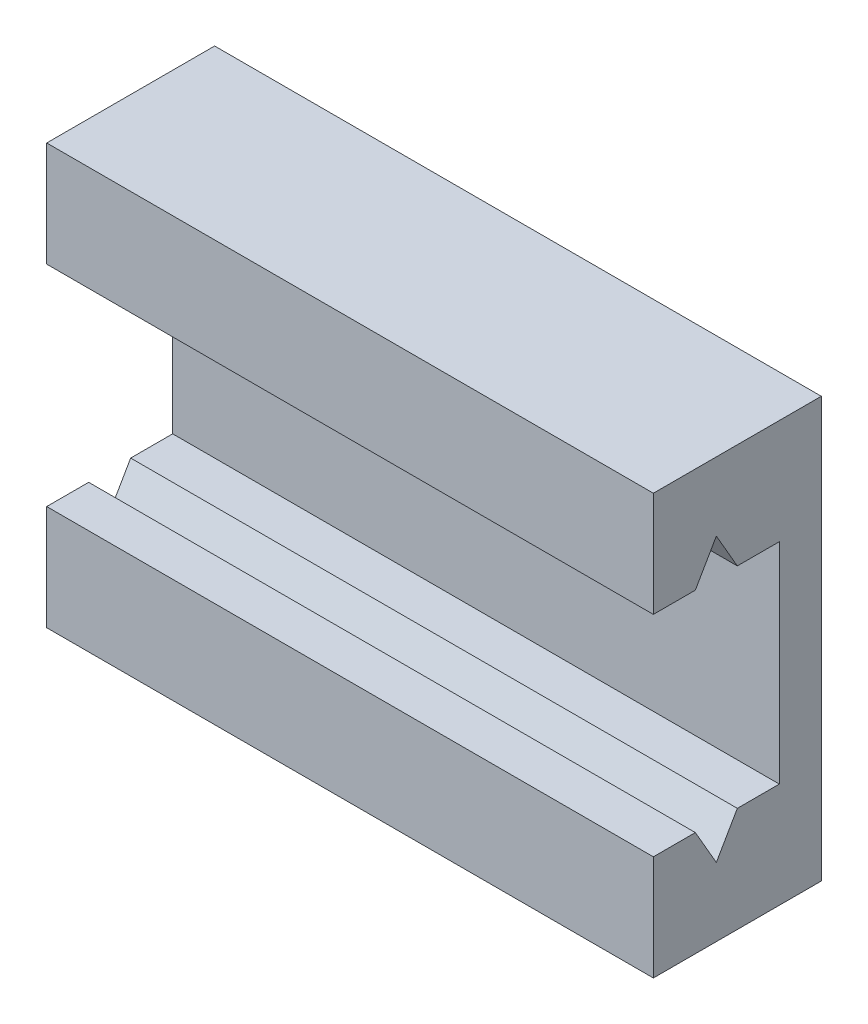
ISO-10303-21;
HEADER;
FILE_DESCRIPTION(('STEP AP214'),'2;1');
FILE_NAME('part.step','',(''),(''),'','','');
FILE_SCHEMA(('AUTOMOTIVE_DESIGN { 1 0 10303 214 1 1 1 1 }'));
ENDSEC;
DATA;
#1=APPLICATION_CONTEXT('core data for automotive mechanical design processes');
#2=APPLICATION_PROTOCOL_DEFINITION('international standard','automotive_design',2000,#1);
#3=PRODUCT_CONTEXT('',#1,'mechanical');
#4=PRODUCT('Part','Part','',(#3));
#5=PRODUCT_RELATED_PRODUCT_CATEGORY('part','',(#4));
#6=PRODUCT_DEFINITION_FORMATION('','',#4);
#7=PRODUCT_DEFINITION_CONTEXT('part definition',#1,'design');
#8=PRODUCT_DEFINITION('design','',#6,#7);
#9=PRODUCT_DEFINITION_SHAPE('','',#8);
#10=(LENGTH_UNIT() NAMED_UNIT(*) SI_UNIT(.MILLI.,.METRE.));
#11=(NAMED_UNIT(*) PLANE_ANGLE_UNIT() SI_UNIT($,.RADIAN.));
#12=(NAMED_UNIT(*) SI_UNIT($,.STERADIAN.) SOLID_ANGLE_UNIT());
#13=UNCERTAINTY_MEASURE_WITH_UNIT(LENGTH_MEASURE(1.E-05),#10,'distance_accuracy_value','');
#14=(GEOMETRIC_REPRESENTATION_CONTEXT(3) GLOBAL_UNCERTAINTY_ASSIGNED_CONTEXT((#13)) GLOBAL_UNIT_ASSIGNED_CONTEXT((#10,
#11,#12)) REPRESENTATION_CONTEXT('',''));
#15=CARTESIAN_POINT('',(0.,0.,0.));
#16=DIRECTION('',(0.,0.,1.));
#17=DIRECTION('',(1.,0.,0.));
#18=AXIS2_PLACEMENT_3D('',#15,#16,#17);
#19=CARTESIAN_POINT('',(0.,0.,8.));
#20=DIRECTION('',(0.,0.,-1.));
#21=DIRECTION('',(-1.,0.,0.));
#22=AXIS2_PLACEMENT_3D('',#19,#20,#21);
#23=PLANE('',#22);
#24=DIRECTION('',(0.,-1.,0.));
#25=VECTOR('',#24,1.);
#26=CARTESIAN_POINT('',(0.,0.,8.));
#27=LINE('',#26,#25);
#28=CARTESIAN_POINT('',(0.,20.,8.));
#29=VERTEX_POINT('',#28);
#30=CARTESIAN_POINT('',(0.,15.,8.));
#31=VERTEX_POINT('',#30);
#32=EDGE_CURVE('E195',#29,#31,#27,.T.);
#33=ORIENTED_EDGE('',*,*,#32,.T.);
#34=DIRECTION('',(1.,0.,0.));
#35=VECTOR('',#34,1.);
#36=CARTESIAN_POINT('',(-0.001000000000001,15.,8.));
#37=LINE('',#36,#35);
#38=CARTESIAN_POINT('',(28.9,15.,8.));
#39=VERTEX_POINT('',#38);
#40=EDGE_CURVE('E200',#31,#39,#37,.T.);
#41=ORIENTED_EDGE('',*,*,#40,.T.);
#42=DIRECTION('',(0.,1.,0.));
#43=VECTOR('',#42,1.);
#44=CARTESIAN_POINT('',(28.9,0.,8.));
#45=LINE('',#44,#43);
#46=CARTESIAN_POINT('',(28.9,20.,8.));
#47=VERTEX_POINT('',#46);
#48=EDGE_CURVE('E167',#39,#47,#45,.T.);
#49=ORIENTED_EDGE('',*,*,#48,.T.);
#50=DIRECTION('',(-1.,0.,0.));
#51=VECTOR('',#50,1.);
#52=CARTESIAN_POINT('',(0.,20.,8.));
#53=LINE('',#52,#51);
#54=EDGE_CURVE('E59',#47,#29,#53,.T.);
#55=ORIENTED_EDGE('',*,*,#54,.T.);
#56=EDGE_LOOP('',(#33,#41,#49,#55));
#57=FACE_BOUND('',#56,.T.);
#58=ADVANCED_FACE('F35',(#57),#23,.F.);
#59=CARTESIAN_POINT('',(0.,0.,8.));
#60=DIRECTION('',(1.,0.,0.));
#61=DIRECTION('',(0.,0.,-1.));
#62=AXIS2_PLACEMENT_3D('',#59,#60,#61);
#63=PLANE('',#62);
#64=DIRECTION('',(0.,0.86602540378444,-0.499999999999998));
#65=VECTOR('',#64,1.);
#66=CARTESIAN_POINT('',(0.,15.,6.));
#67=LINE('',#66,#65);
#68=CARTESIAN_POINT('',(0.,15.,6.));
#69=VERTEX_POINT('',#68);
#70=CARTESIAN_POINT('',(0.,16.7320508075689,5.));
#71=VERTEX_POINT('',#70);
#72=EDGE_CURVE('E250',#69,#71,#67,.T.);
#73=ORIENTED_EDGE('',*,*,#72,.F.);
#74=DIRECTION('',(0.,0.,-1.));
#75=VECTOR('',#74,1.);
#76=CARTESIAN_POINT('',(0.,15.,8.));
#77=LINE('',#76,#75);
#78=EDGE_CURVE('E162',#31,#69,#77,.T.);
#79=ORIENTED_EDGE('',*,*,#78,.F.);
#80=ORIENTED_EDGE('',*,*,#32,.F.);
#81=DIRECTION('',(0.,0.,-1.));
#82=VECTOR('',#81,1.);
#83=CARTESIAN_POINT('',(0.,20.,8.));
#84=LINE('',#83,#82);
#85=CARTESIAN_POINT('',(0.,20.,0.));
#86=VERTEX_POINT('',#85);
#87=EDGE_CURVE('E169',#29,#86,#84,.T.);
#88=ORIENTED_EDGE('',*,*,#87,.T.);
#89=DIRECTION('',(0.,-1.,0.));
#90=VECTOR('',#89,1.);
#91=CARTESIAN_POINT('',(0.,0.,0.));
#92=LINE('',#91,#90);
#93=CARTESIAN_POINT('',(0.,0.,0.));
#94=VERTEX_POINT('',#93);
#95=EDGE_CURVE('E174',#86,#94,#92,.T.);
#96=ORIENTED_EDGE('',*,*,#95,.T.);
#97=DIRECTION('',(0.,0.,-1.));
#98=VECTOR('',#97,1.);
#99=CARTESIAN_POINT('',(0.,0.,8.));
#100=LINE('',#99,#98);
#101=CARTESIAN_POINT('',(0.,0.,8.));
#102=VERTEX_POINT('',#101);
#103=EDGE_CURVE('E11',#102,#94,#100,.T.);
#104=ORIENTED_EDGE('',*,*,#103,.F.);
#105=CARTESIAN_POINT('',(0.,5.,8.));
#106=VERTEX_POINT('',#105);
#107=EDGE_CURVE('E87',#106,#102,#27,.T.);
#108=ORIENTED_EDGE('',*,*,#107,.F.);
#109=DIRECTION('',(0.,0.,1.));
#110=VECTOR('',#109,1.);
#111=CARTESIAN_POINT('',(0.,5.,8.));
#112=LINE('',#111,#110);
#113=CARTESIAN_POINT('',(0.,5.,6.));
#114=VERTEX_POINT('',#113);
#115=EDGE_CURVE('E50',#114,#106,#112,.T.);
#116=ORIENTED_EDGE('',*,*,#115,.F.);
#117=DIRECTION('',(0.,0.86602540378444,0.499999999999998));
#118=VECTOR('',#117,1.);
#119=CARTESIAN_POINT('',(0.,5.,6.));
#120=LINE('',#119,#118);
#121=CARTESIAN_POINT('',(0.,3.26794919243112,5.));
#122=VERTEX_POINT('',#121);
#123=EDGE_CURVE('E226',#122,#114,#120,.T.);
#124=ORIENTED_EDGE('',*,*,#123,.F.);
#125=DIRECTION('',(0.,-0.86602540378444,0.499999999999998));
#126=VECTOR('',#125,1.);
#127=CARTESIAN_POINT('',(0.,3.26794919243112,5.));
#128=LINE('',#127,#126);
#129=CARTESIAN_POINT('',(0.,5.,4.));
#130=VERTEX_POINT('',#129);
#131=EDGE_CURVE('E229',#130,#122,#128,.T.);
#132=ORIENTED_EDGE('',*,*,#131,.F.);
#133=DIRECTION('',(0.,0.,1.));
#134=VECTOR('',#133,1.);
#135=CARTESIAN_POINT('',(0.,5.,4.));
#136=LINE('',#135,#134);
#137=CARTESIAN_POINT('',(0.,5.,2.));
#138=VERTEX_POINT('',#137);
#139=EDGE_CURVE('E232',#138,#130,#136,.T.);
#140=ORIENTED_EDGE('',*,*,#139,.F.);
#141=DIRECTION('',(0.,-1.,0.));
#142=VECTOR('',#141,1.);
#143=CARTESIAN_POINT('',(0.,15.,2.));
#144=LINE('',#143,#142);
#145=CARTESIAN_POINT('',(0.,15.,2.));
#146=VERTEX_POINT('',#145);
#147=EDGE_CURVE('E241',#146,#138,#144,.T.);
#148=ORIENTED_EDGE('',*,*,#147,.F.);
#149=DIRECTION('',(0.,0.,-1.));
#150=VECTOR('',#149,1.);
#151=CARTESIAN_POINT('',(0.,15.,4.));
#152=LINE('',#151,#150);
#153=CARTESIAN_POINT('',(0.,15.,4.));
#154=VERTEX_POINT('',#153);
#155=EDGE_CURVE('E244',#154,#146,#152,.T.);
#156=ORIENTED_EDGE('',*,*,#155,.F.);
#157=DIRECTION('',(0.,-0.86602540378444,-0.499999999999998));
#158=VECTOR('',#157,1.);
#159=CARTESIAN_POINT('',(0.,16.7320508075689,5.));
#160=LINE('',#159,#158);
#161=EDGE_CURVE('E247',#71,#154,#160,.T.);
#162=ORIENTED_EDGE('',*,*,#161,.F.);
#163=EDGE_LOOP('',(#73,#79,#80,#88,#96,#104,#108,#116,#124,#132,#140,#148,#156,#162));
#164=FACE_BOUND('',#163,.T.);
#165=ADVANCED_FACE('F37',(#164),#63,.F.);
#166=CARTESIAN_POINT('',(0.,0.,8.));
#167=DIRECTION('',(0.,1.,0.));
#168=DIRECTION('',(0.,0.,1.));
#169=AXIS2_PLACEMENT_3D('',#166,#167,#168);
#170=PLANE('',#169);
#171=DIRECTION('',(1.,0.,0.));
#172=VECTOR('',#171,1.);
#173=CARTESIAN_POINT('',(0.,0.,0.));
#174=LINE('',#173,#172);
#175=CARTESIAN_POINT('',(28.9,0.,0.));
#176=VERTEX_POINT('',#175);
#177=EDGE_CURVE('E177',#94,#176,#174,.T.);
#178=ORIENTED_EDGE('',*,*,#177,.T.);
#179=DIRECTION('',(0.,0.,-1.));
#180=VECTOR('',#179,1.);
#181=CARTESIAN_POINT('',(28.9,0.,8.));
#182=LINE('',#181,#180);
#183=CARTESIAN_POINT('',(28.9,0.,8.));
#184=VERTEX_POINT('',#183);
#185=EDGE_CURVE('E43',#184,#176,#182,.T.);
#186=ORIENTED_EDGE('',*,*,#185,.F.);
#187=DIRECTION('',(1.,0.,0.));
#188=VECTOR('',#187,1.);
#189=CARTESIAN_POINT('',(0.,0.,8.));
#190=LINE('',#189,#188);
#191=EDGE_CURVE('E165',#102,#184,#190,.T.);
#192=ORIENTED_EDGE('',*,*,#191,.F.);
#193=ORIENTED_EDGE('',*,*,#103,.T.);
#194=EDGE_LOOP('',(#178,#186,#192,#193));
#195=FACE_BOUND('',#194,.T.);
#196=ADVANCED_FACE('F305',(#195),#170,.F.);
#197=CARTESIAN_POINT('',(28.9,0.,8.));
#198=DIRECTION('',(-1.,0.,0.));
#199=DIRECTION('',(0.,0.,1.));
#200=AXIS2_PLACEMENT_3D('',#197,#198,#199);
#201=PLANE('',#200);
#202=ORIENTED_EDGE('',*,*,#48,.F.);
#203=DIRECTION('',(0.,0.,1.));
#204=VECTOR('',#203,1.);
#205=CARTESIAN_POINT('',(28.9,15.,8.));
#206=LINE('',#205,#204);
#207=CARTESIAN_POINT('',(28.9,15.,6.));
#208=VERTEX_POINT('',#207);
#209=EDGE_CURVE('E151',#208,#39,#206,.T.);
#210=ORIENTED_EDGE('',*,*,#209,.F.);
#211=DIRECTION('',(0.,-0.86602540378444,0.499999999999998));
#212=VECTOR('',#211,1.);
#213=CARTESIAN_POINT('',(28.9,15.,6.));
#214=LINE('',#213,#212);
#215=CARTESIAN_POINT('',(28.9,16.7320508075689,5.));
#216=VERTEX_POINT('',#215);
#217=EDGE_CURVE('E269',#216,#208,#214,.T.);
#218=ORIENTED_EDGE('',*,*,#217,.F.);
#219=DIRECTION('',(0.,0.86602540378444,0.499999999999998));
#220=VECTOR('',#219,1.);
#221=CARTESIAN_POINT('',(28.9,16.7320508075689,5.));
#222=LINE('',#221,#220);
#223=CARTESIAN_POINT('',(28.9,15.,4.));
#224=VERTEX_POINT('',#223);
#225=EDGE_CURVE('E267',#224,#216,#222,.T.);
#226=ORIENTED_EDGE('',*,*,#225,.F.);
#227=DIRECTION('',(0.,0.,1.));
#228=VECTOR('',#227,1.);
#229=CARTESIAN_POINT('',(28.9,15.,4.));
#230=LINE('',#229,#228);
#231=CARTESIAN_POINT('',(28.9,15.,2.));
#232=VERTEX_POINT('',#231);
#233=EDGE_CURVE('E264',#232,#224,#230,.T.);
#234=ORIENTED_EDGE('',*,*,#233,.F.);
#235=DIRECTION('',(0.,1.,0.));
#236=VECTOR('',#235,1.);
#237=CARTESIAN_POINT('',(28.9,15.,2.));
#238=LINE('',#237,#236);
#239=CARTESIAN_POINT('',(28.9,5.,2.));
#240=VERTEX_POINT('',#239);
#241=EDGE_CURVE('E261',#240,#232,#238,.T.);
#242=ORIENTED_EDGE('',*,*,#241,.F.);
#243=DIRECTION('',(0.,0.,-1.));
#244=VECTOR('',#243,1.);
#245=CARTESIAN_POINT('',(28.9,5.,4.));
#246=LINE('',#245,#244);
#247=CARTESIAN_POINT('',(28.9,5.,4.));
#248=VERTEX_POINT('',#247);
#249=EDGE_CURVE('E258',#248,#240,#246,.T.);
#250=ORIENTED_EDGE('',*,*,#249,.F.);
#251=DIRECTION('',(0.,0.86602540378444,-0.499999999999998));
#252=VECTOR('',#251,1.);
#253=CARTESIAN_POINT('',(28.9,3.26794919243112,5.));
#254=LINE('',#253,#252);
#255=CARTESIAN_POINT('',(28.9,3.26794919243112,5.));
#256=VERTEX_POINT('',#255);
#257=EDGE_CURVE('E255',#256,#248,#254,.T.);
#258=ORIENTED_EDGE('',*,*,#257,.F.);
#259=DIRECTION('',(0.,-0.86602540378444,-0.499999999999998));
#260=VECTOR('',#259,1.);
#261=CARTESIAN_POINT('',(28.9,5.,6.));
#262=LINE('',#261,#260);
#263=CARTESIAN_POINT('',(28.9,5.,6.));
#264=VERTEX_POINT('',#263);
#265=EDGE_CURVE('E161',#264,#256,#262,.T.);
#266=ORIENTED_EDGE('',*,*,#265,.F.);
#267=DIRECTION('',(0.,0.,-1.));
#268=VECTOR('',#267,1.);
#269=CARTESIAN_POINT('',(28.9,5.,8.));
#270=LINE('',#269,#268);
#271=CARTESIAN_POINT('',(28.9,5.,8.));
#272=VERTEX_POINT('',#271);
#273=EDGE_CURVE('E147',#272,#264,#270,.T.);
#274=ORIENTED_EDGE('',*,*,#273,.F.);
#275=EDGE_CURVE('E158',#184,#272,#45,.T.);
#276=ORIENTED_EDGE('',*,*,#275,.F.);
#277=ORIENTED_EDGE('',*,*,#185,.T.);
#278=DIRECTION('',(0.,1.,0.));
#279=VECTOR('',#278,1.);
#280=CARTESIAN_POINT('',(28.9,0.,0.));
#281=LINE('',#280,#279);
#282=CARTESIAN_POINT('',(28.9,20.,0.));
#283=VERTEX_POINT('',#282);
#284=EDGE_CURVE('E179',#176,#283,#281,.T.);
#285=ORIENTED_EDGE('',*,*,#284,.T.);
#286=DIRECTION('',(0.,0.,-1.));
#287=VECTOR('',#286,1.);
#288=CARTESIAN_POINT('',(28.9,20.,8.));
#289=LINE('',#288,#287);
#290=EDGE_CURVE('E183',#47,#283,#289,.T.);
#291=ORIENTED_EDGE('',*,*,#290,.F.);
#292=EDGE_LOOP('',(#202,#210,#218,#226,#234,#242,#250,#258,#266,#274,#276,#277,#285,#291));
#293=FACE_BOUND('',#292,.T.);
#294=ADVANCED_FACE('F156',(#293),#201,.F.);
#295=CARTESIAN_POINT('',(0.,20.,8.));
#296=DIRECTION('',(0.,-1.,0.));
#297=DIRECTION('',(0.,0.,-1.));
#298=AXIS2_PLACEMENT_3D('',#295,#296,#297);
#299=PLANE('',#298);
#300=DIRECTION('',(-1.,0.,0.));
#301=VECTOR('',#300,1.);
#302=CARTESIAN_POINT('',(0.,20.,0.));
#303=LINE('',#302,#301);
#304=EDGE_CURVE('E80',#283,#86,#303,.T.);
#305=ORIENTED_EDGE('',*,*,#304,.T.);
#306=ORIENTED_EDGE('',*,*,#87,.F.);
#307=ORIENTED_EDGE('',*,*,#54,.F.);
#308=ORIENTED_EDGE('',*,*,#290,.T.);
#309=EDGE_LOOP('',(#305,#306,#307,#308));
#310=FACE_BOUND('',#309,.T.);
#311=ADVANCED_FACE('F196',(#310),#299,.F.);
#312=ORIENTED_EDGE('',*,*,#275,.T.);
#313=DIRECTION('',(1.,0.,0.));
#314=VECTOR('',#313,1.);
#315=CARTESIAN_POINT('',(-0.001000000000001,5.,8.));
#316=LINE('',#315,#314);
#317=EDGE_CURVE('E144',#106,#272,#316,.T.);
#318=ORIENTED_EDGE('',*,*,#317,.F.);
#319=ORIENTED_EDGE('',*,*,#107,.T.);
#320=ORIENTED_EDGE('',*,*,#191,.T.);
#321=EDGE_LOOP('',(#312,#318,#319,#320));
#322=FACE_BOUND('',#321,.T.);
#323=ADVANCED_FACE('F164',(#322),#23,.F.);
#324=CARTESIAN_POINT('',(0.,0.,0.));
#325=DIRECTION('',(0.,0.,-1.));
#326=DIRECTION('',(-1.,0.,0.));
#327=AXIS2_PLACEMENT_3D('',#324,#325,#326);
#328=PLANE('',#327);
#329=CARTESIAN_POINT('',(9.45,17.5,0.));
#330=DIRECTION('',(0.,0.,-1.));
#331=DIRECTION('',(-1.,0.,0.));
#332=AXIS2_PLACEMENT_3D('',#329,#330,#331);
#333=CIRCLE('',#332,1.5);
#334=CARTESIAN_POINT('',(7.94999999999999,17.5,0.));
#335=VERTEX_POINT('',#334);
#336=EDGE_CURVE('E492',#335,#335,#333,.T.);
#337=ORIENTED_EDGE('',*,*,#336,.F.);
#338=EDGE_LOOP('',(#337));
#339=FACE_BOUND('',#338,.T.);
#340=CARTESIAN_POINT('',(19.45,2.5,0.));
#341=DIRECTION('',(0.,0.,-1.));
#342=DIRECTION('',(-1.,0.,0.));
#343=AXIS2_PLACEMENT_3D('',#340,#341,#342);
#344=CIRCLE('',#343,1.5);
#345=CARTESIAN_POINT('',(17.95,2.5,0.));
#346=VERTEX_POINT('',#345);
#347=EDGE_CURVE('E504',#346,#346,#344,.T.);
#348=ORIENTED_EDGE('',*,*,#347,.F.);
#349=EDGE_LOOP('',(#348));
#350=FACE_BOUND('',#349,.T.);
#351=CARTESIAN_POINT('',(9.45,2.5,0.));
#352=DIRECTION('',(0.,0.,-1.));
#353=DIRECTION('',(-1.,0.,0.));
#354=AXIS2_PLACEMENT_3D('',#351,#352,#353);
#355=CIRCLE('',#354,1.5);
#356=CARTESIAN_POINT('',(7.94999999999999,2.5,0.));
#357=VERTEX_POINT('',#356);
#358=EDGE_CURVE('E499',#357,#357,#355,.T.);
#359=ORIENTED_EDGE('',*,*,#358,.F.);
#360=EDGE_LOOP('',(#359));
#361=FACE_BOUND('',#360,.T.);
#362=CARTESIAN_POINT('',(19.45,17.5,0.));
#363=DIRECTION('',(0.,0.,-1.));
#364=DIRECTION('',(-1.,0.,0.));
#365=AXIS2_PLACEMENT_3D('',#362,#363,#364);
#366=CIRCLE('',#365,1.5);
#367=CARTESIAN_POINT('',(17.95,17.5,0.));
#368=VERTEX_POINT('',#367);
#369=EDGE_CURVE('E235',#368,#368,#366,.T.);
#370=ORIENTED_EDGE('',*,*,#369,.F.);
#371=EDGE_LOOP('',(#370));
#372=FACE_BOUND('',#371,.T.);
#373=ORIENTED_EDGE('',*,*,#95,.F.);
#374=ORIENTED_EDGE('',*,*,#304,.F.);
#375=ORIENTED_EDGE('',*,*,#284,.F.);
#376=ORIENTED_EDGE('',*,*,#177,.F.);
#377=EDGE_LOOP('',(#373,#374,#375,#376));
#378=FACE_BOUND('',#377,.T.);
#379=ADVANCED_FACE('F189',(#339,#350,#361,#372,#378),#328,.T.);
#380=CARTESIAN_POINT('',(-0.001000000000001,15.,8.));
#381=DIRECTION('',(0.,1.,0.));
#382=DIRECTION('',(0.,0.,1.));
#383=AXIS2_PLACEMENT_3D('',#380,#381,#382);
#384=PLANE('',#383);
#385=ORIENTED_EDGE('',*,*,#78,.T.);
#386=DIRECTION('',(1.,0.,0.));
#387=VECTOR('',#386,1.);
#388=CARTESIAN_POINT('',(-0.001000000000001,15.,6.));
#389=LINE('',#388,#387);
#390=EDGE_CURVE('E203',#69,#208,#389,.T.);
#391=ORIENTED_EDGE('',*,*,#390,.T.);
#392=ORIENTED_EDGE('',*,*,#209,.T.);
#393=ORIENTED_EDGE('',*,*,#40,.F.);
#394=EDGE_LOOP('',(#385,#391,#392,#393));
#395=FACE_BOUND('',#394,.T.);
#396=ADVANCED_FACE('F272',(#395),#384,.F.);
#397=CARTESIAN_POINT('',(-0.001000000000001,15.,6.));
#398=DIRECTION('',(0.,0.499999999999998,0.86602540378444));
#399=DIRECTION('',(0.,-0.86602540378444,0.499999999999998));
#400=AXIS2_PLACEMENT_3D('',#397,#398,#399);
#401=PLANE('',#400);
#402=ORIENTED_EDGE('',*,*,#72,.T.);
#403=DIRECTION('',(1.,0.,0.));
#404=VECTOR('',#403,1.);
#405=CARTESIAN_POINT('',(-0.001000000000001,16.7320508075689,5.));
#406=LINE('',#405,#404);
#407=EDGE_CURVE('E206',#71,#216,#406,.T.);
#408=ORIENTED_EDGE('',*,*,#407,.T.);
#409=ORIENTED_EDGE('',*,*,#217,.T.);
#410=ORIENTED_EDGE('',*,*,#390,.F.);
#411=EDGE_LOOP('',(#402,#408,#409,#410));
#412=FACE_BOUND('',#411,.T.);
#413=ADVANCED_FACE('F273',(#412),#401,.F.);
#414=CARTESIAN_POINT('',(-0.001000000000001,16.7320508075689,5.));
#415=DIRECTION('',(0.,0.499999999999998,-0.86602540378444));
#416=DIRECTION('',(0.,0.86602540378444,0.499999999999998));
#417=AXIS2_PLACEMENT_3D('',#414,#415,#416);
#418=PLANE('',#417);
#419=ORIENTED_EDGE('',*,*,#161,.T.);
#420=DIRECTION('',(1.,0.,0.));
#421=VECTOR('',#420,1.);
#422=CARTESIAN_POINT('',(-0.001000000000001,15.,4.));
#423=LINE('',#422,#421);
#424=EDGE_CURVE('E212',#154,#224,#423,.T.);
#425=ORIENTED_EDGE('',*,*,#424,.T.);
#426=ORIENTED_EDGE('',*,*,#225,.T.);
#427=ORIENTED_EDGE('',*,*,#407,.F.);
#428=EDGE_LOOP('',(#419,#425,#426,#427));
#429=FACE_BOUND('',#428,.T.);
#430=ADVANCED_FACE('F278',(#429),#418,.F.);
#431=CARTESIAN_POINT('',(-0.001000000000001,15.,4.));
#432=DIRECTION('',(0.,1.,0.));
#433=DIRECTION('',(0.,0.,1.));
#434=AXIS2_PLACEMENT_3D('',#431,#432,#433);
#435=PLANE('',#434);
#436=ORIENTED_EDGE('',*,*,#155,.T.);
#437=DIRECTION('',(1.,0.,0.));
#438=VECTOR('',#437,1.);
#439=CARTESIAN_POINT('',(-0.001000000000001,15.,2.));
#440=LINE('',#439,#438);
#441=EDGE_CURVE('E214',#146,#232,#440,.T.);
#442=ORIENTED_EDGE('',*,*,#441,.T.);
#443=ORIENTED_EDGE('',*,*,#233,.T.);
#444=ORIENTED_EDGE('',*,*,#424,.F.);
#445=EDGE_LOOP('',(#436,#442,#443,#444));
#446=FACE_BOUND('',#445,.T.);
#447=ADVANCED_FACE('F284',(#446),#435,.F.);
#448=CARTESIAN_POINT('',(-0.001000000000001,15.,2.));
#449=DIRECTION('',(0.,0.,-1.));
#450=DIRECTION('',(-1.,0.,0.));
#451=AXIS2_PLACEMENT_3D('',#448,#449,#450);
#452=PLANE('',#451);
#453=ORIENTED_EDGE('',*,*,#147,.T.);
#454=DIRECTION('',(1.,0.,0.));
#455=VECTOR('',#454,1.);
#456=CARTESIAN_POINT('',(-0.001000000000001,5.,2.));
#457=LINE('',#456,#455);
#458=EDGE_CURVE('E216',#138,#240,#457,.T.);
#459=ORIENTED_EDGE('',*,*,#458,.T.);
#460=ORIENTED_EDGE('',*,*,#241,.T.);
#461=ORIENTED_EDGE('',*,*,#441,.F.);
#462=EDGE_LOOP('',(#453,#459,#460,#461));
#463=FACE_BOUND('',#462,.T.);
#464=ADVANCED_FACE('F286',(#463),#452,.F.);
#465=CARTESIAN_POINT('',(-0.001000000000001,5.,4.));
#466=DIRECTION('',(0.,-1.,0.));
#467=DIRECTION('',(0.,0.,-1.));
#468=AXIS2_PLACEMENT_3D('',#465,#466,#467);
#469=PLANE('',#468);
#470=ORIENTED_EDGE('',*,*,#139,.T.);
#471=DIRECTION('',(1.,0.,0.));
#472=VECTOR('',#471,1.);
#473=CARTESIAN_POINT('',(-0.001000000000001,5.,4.));
#474=LINE('',#473,#472);
#475=EDGE_CURVE('E218',#130,#248,#474,.T.);
#476=ORIENTED_EDGE('',*,*,#475,.T.);
#477=ORIENTED_EDGE('',*,*,#249,.T.);
#478=ORIENTED_EDGE('',*,*,#458,.F.);
#479=EDGE_LOOP('',(#470,#476,#477,#478));
#480=FACE_BOUND('',#479,.T.);
#481=ADVANCED_FACE('F289',(#480),#469,.F.);
#482=CARTESIAN_POINT('',(-0.001000000000001,3.26794919243112,5.));
#483=DIRECTION('',(0.,-0.499999999999998,-0.86602540378444));
#484=DIRECTION('',(0.,0.86602540378444,-0.499999999999998));
#485=AXIS2_PLACEMENT_3D('',#482,#483,#484);
#486=PLANE('',#485);
#487=ORIENTED_EDGE('',*,*,#131,.T.);
#488=DIRECTION('',(1.,0.,0.));
#489=VECTOR('',#488,1.);
#490=CARTESIAN_POINT('',(-0.001000000000001,3.26794919243112,5.));
#491=LINE('',#490,#489);
#492=EDGE_CURVE('E220',#122,#256,#491,.T.);
#493=ORIENTED_EDGE('',*,*,#492,.T.);
#494=ORIENTED_EDGE('',*,*,#257,.T.);
#495=ORIENTED_EDGE('',*,*,#475,.F.);
#496=EDGE_LOOP('',(#487,#493,#494,#495));
#497=FACE_BOUND('',#496,.T.);
#498=ADVANCED_FACE('F291',(#497),#486,.F.);
#499=CARTESIAN_POINT('',(-0.001000000000001,5.,6.));
#500=DIRECTION('',(0.,-0.499999999999998,0.86602540378444));
#501=DIRECTION('',(0.,-0.86602540378444,-0.499999999999998));
#502=AXIS2_PLACEMENT_3D('',#499,#500,#501);
#503=PLANE('',#502);
#504=ORIENTED_EDGE('',*,*,#123,.T.);
#505=DIRECTION('',(1.,0.,0.));
#506=VECTOR('',#505,1.);
#507=CARTESIAN_POINT('',(-0.001000000000001,5.,6.));
#508=LINE('',#507,#506);
#509=EDGE_CURVE('E150',#114,#264,#508,.T.);
#510=ORIENTED_EDGE('',*,*,#509,.T.);
#511=ORIENTED_EDGE('',*,*,#265,.T.);
#512=ORIENTED_EDGE('',*,*,#492,.F.);
#513=EDGE_LOOP('',(#504,#510,#511,#512));
#514=FACE_BOUND('',#513,.T.);
#515=ADVANCED_FACE('F224',(#514),#503,.F.);
#516=CARTESIAN_POINT('',(-0.001000000000001,5.,8.));
#517=DIRECTION('',(0.,-1.,0.));
#518=DIRECTION('',(0.,0.,-1.));
#519=AXIS2_PLACEMENT_3D('',#516,#517,#518);
#520=PLANE('',#519);
#521=ORIENTED_EDGE('',*,*,#115,.T.);
#522=ORIENTED_EDGE('',*,*,#317,.T.);
#523=ORIENTED_EDGE('',*,*,#273,.T.);
#524=ORIENTED_EDGE('',*,*,#509,.F.);
#525=EDGE_LOOP('',(#521,#522,#523,#524));
#526=FACE_BOUND('',#525,.T.);
#527=ADVANCED_FACE('F146',(#526),#520,.F.);
#528=CARTESIAN_POINT('',(19.45,17.5,4.));
#529=DIRECTION('',(0.,0.,-1.));
#530=DIRECTION('',(-1.,0.,0.));
#531=AXIS2_PLACEMENT_3D('',#528,#529,#530);
#532=CYLINDRICAL_SURFACE('',#531,1.5);
#533=CARTESIAN_POINT('',(19.45,17.5,4.));
#534=DIRECTION('',(0.,0.,-1.));
#535=DIRECTION('',(-1.,0.,0.));
#536=AXIS2_PLACEMENT_3D('',#533,#534,#535);
#537=CIRCLE('',#536,1.5);
#538=CARTESIAN_POINT('',(17.95,17.5,4.));
#539=VERTEX_POINT('',#538);
#540=EDGE_CURVE('E230',#539,#539,#537,.T.);
#541=ORIENTED_EDGE('',*,*,#540,.F.);
#542=EDGE_LOOP('',(#541));
#543=FACE_BOUND('',#542,.T.);
#544=ORIENTED_EDGE('',*,*,#369,.T.);
#545=EDGE_LOOP('',(#544));
#546=FACE_BOUND('',#545,.T.);
#547=ADVANCED_FACE('F402',(#543,#546),#532,.F.);
#548=CARTESIAN_POINT('',(19.45,17.5,4.));
#549=DIRECTION('',(0.,0.,-1.));
#550=DIRECTION('',(-1.,0.,0.));
#551=AXIS2_PLACEMENT_3D('',#548,#549,#550);
#552=PLANE('',#551);
#553=ORIENTED_EDGE('',*,*,#540,.T.);
#554=EDGE_LOOP('',(#553));
#555=FACE_BOUND('',#554,.T.);
#556=ADVANCED_FACE('F415',(#555),#552,.T.);
#557=CARTESIAN_POINT('',(9.45,2.5,4.));
#558=DIRECTION('',(0.,0.,-1.));
#559=DIRECTION('',(-1.,0.,0.));
#560=AXIS2_PLACEMENT_3D('',#557,#558,#559);
#561=CYLINDRICAL_SURFACE('',#560,1.5);
#562=CARTESIAN_POINT('',(9.45,2.5,4.));
#563=DIRECTION('',(0.,0.,-1.));
#564=DIRECTION('',(-1.,0.,0.));
#565=AXIS2_PLACEMENT_3D('',#562,#563,#564);
#566=CIRCLE('',#565,1.5);
#567=CARTESIAN_POINT('',(7.94999999999999,2.5,4.));
#568=VERTEX_POINT('',#567);
#569=EDGE_CURVE('E506',#568,#568,#566,.T.);
#570=ORIENTED_EDGE('',*,*,#569,.F.);
#571=EDGE_LOOP('',(#570));
#572=FACE_BOUND('',#571,.T.);
#573=ORIENTED_EDGE('',*,*,#358,.T.);
#574=EDGE_LOOP('',(#573));
#575=FACE_BOUND('',#574,.T.);
#576=ADVANCED_FACE('F425',(#572,#575),#561,.F.);
#577=CARTESIAN_POINT('',(9.45,2.5,4.));
#578=DIRECTION('',(0.,0.,-1.));
#579=DIRECTION('',(-1.,0.,0.));
#580=AXIS2_PLACEMENT_3D('',#577,#578,#579);
#581=PLANE('',#580);
#582=ORIENTED_EDGE('',*,*,#569,.T.);
#583=EDGE_LOOP('',(#582));
#584=FACE_BOUND('',#583,.T.);
#585=ADVANCED_FACE('F435',(#584),#581,.T.);
#586=CARTESIAN_POINT('',(19.45,2.5,4.));
#587=DIRECTION('',(0.,0.,-1.));
#588=DIRECTION('',(-1.,0.,0.));
#589=AXIS2_PLACEMENT_3D('',#586,#587,#588);
#590=CYLINDRICAL_SURFACE('',#589,1.5);
#591=CARTESIAN_POINT('',(19.45,2.5,4.));
#592=DIRECTION('',(0.,0.,-1.));
#593=DIRECTION('',(-1.,0.,0.));
#594=AXIS2_PLACEMENT_3D('',#591,#592,#593);
#595=CIRCLE('',#594,1.5);
#596=CARTESIAN_POINT('',(17.95,2.5,4.));
#597=VERTEX_POINT('',#596);
#598=EDGE_CURVE('E496',#597,#597,#595,.T.);
#599=ORIENTED_EDGE('',*,*,#598,.F.);
#600=EDGE_LOOP('',(#599));
#601=FACE_BOUND('',#600,.T.);
#602=ORIENTED_EDGE('',*,*,#347,.T.);
#603=EDGE_LOOP('',(#602));
#604=FACE_BOUND('',#603,.T.);
#605=ADVANCED_FACE('F445',(#601,#604),#590,.F.);
#606=CARTESIAN_POINT('',(19.45,2.5,4.));
#607=DIRECTION('',(0.,0.,-1.));
#608=DIRECTION('',(-1.,0.,0.));
#609=AXIS2_PLACEMENT_3D('',#606,#607,#608);
#610=PLANE('',#609);
#611=ORIENTED_EDGE('',*,*,#598,.T.);
#612=EDGE_LOOP('',(#611));
#613=FACE_BOUND('',#612,.T.);
#614=ADVANCED_FACE('F455',(#613),#610,.T.);
#615=CARTESIAN_POINT('',(9.45,17.5,4.));
#616=DIRECTION('',(0.,0.,-1.));
#617=DIRECTION('',(-1.,0.,0.));
#618=AXIS2_PLACEMENT_3D('',#615,#616,#617);
#619=CYLINDRICAL_SURFACE('',#618,1.5);
#620=CARTESIAN_POINT('',(9.45,17.5,4.));
#621=DIRECTION('',(0.,0.,-1.));
#622=DIRECTION('',(-1.,0.,0.));
#623=AXIS2_PLACEMENT_3D('',#620,#621,#622);
#624=CIRCLE('',#623,1.5);
#625=CARTESIAN_POINT('',(7.94999999999999,17.5,4.));
#626=VERTEX_POINT('',#625);
#627=EDGE_CURVE('E491',#626,#626,#624,.T.);
#628=ORIENTED_EDGE('',*,*,#627,.F.);
#629=EDGE_LOOP('',(#628));
#630=FACE_BOUND('',#629,.T.);
#631=ORIENTED_EDGE('',*,*,#336,.T.);
#632=EDGE_LOOP('',(#631));
#633=FACE_BOUND('',#632,.T.);
#634=ADVANCED_FACE('F465',(#630,#633),#619,.F.);
#635=CARTESIAN_POINT('',(9.45,17.5,4.));
#636=DIRECTION('',(0.,0.,-1.));
#637=DIRECTION('',(-1.,0.,0.));
#638=AXIS2_PLACEMENT_3D('',#635,#636,#637);
#639=PLANE('',#638);
#640=ORIENTED_EDGE('',*,*,#627,.T.);
#641=EDGE_LOOP('',(#640));
#642=FACE_BOUND('',#641,.T.);
#643=ADVANCED_FACE('F475',(#642),#639,.T.);
#644=CLOSED_SHELL('',(#58,#165,#196,#294,#311,#323,#379,#396,#413,#430,#447,#464,#481,#498,#515,
#527,#547,#556,#576,#585,#605,#614,#634,#643));
#645=MANIFOLD_SOLID_BREP('B2',#644);
#646=ADVANCED_BREP_SHAPE_REPRESENTATION('',(#18,#645),#14);
#647=SHAPE_DEFINITION_REPRESENTATION(#9,#646);
ENDSEC;
END-ISO-10303-21;
